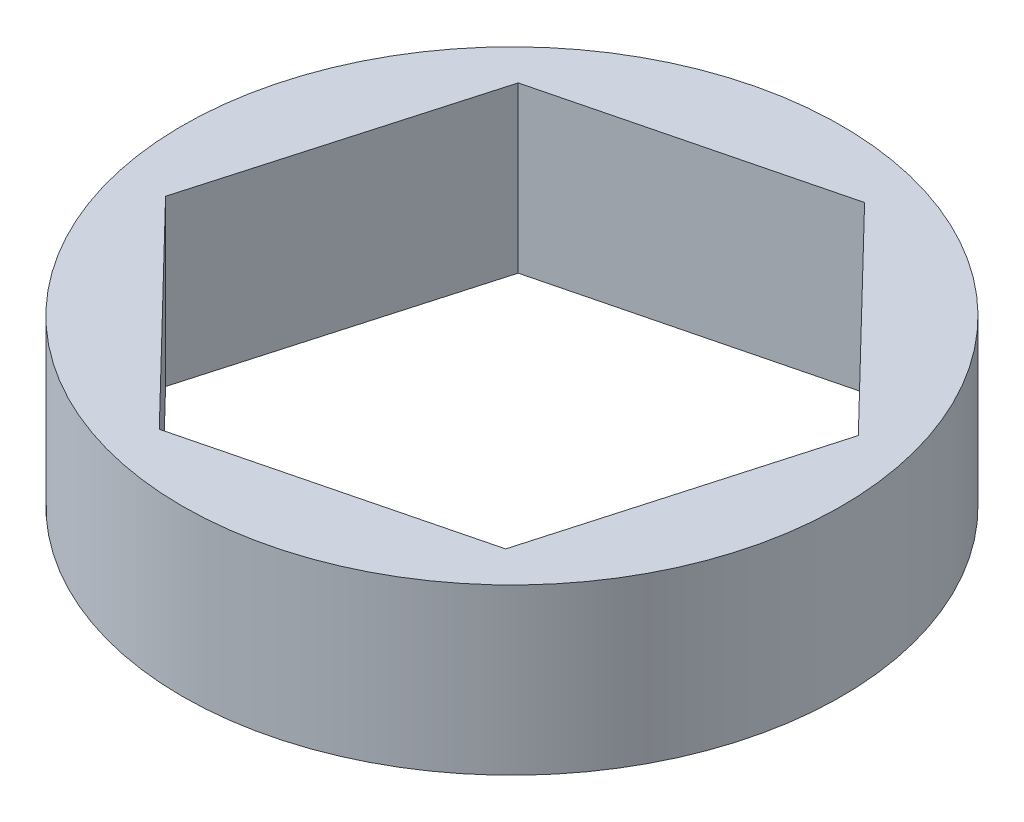
ISO-10303-21;
HEADER;
FILE_DESCRIPTION(('STEP AP214'),'2;1');
FILE_NAME('part.step','',(''),(''),'','','');
FILE_SCHEMA(('AUTOMOTIVE_DESIGN { 1 0 10303 214 1 1 1 1 }'));
ENDSEC;
DATA;
#1=APPLICATION_CONTEXT('core data for automotive mechanical design processes');
#2=APPLICATION_PROTOCOL_DEFINITION('international standard','automotive_design',2000,#1);
#3=PRODUCT_CONTEXT('',#1,'mechanical');
#4=PRODUCT('Part','Part','',(#3));
#5=PRODUCT_RELATED_PRODUCT_CATEGORY('part','',(#4));
#6=PRODUCT_DEFINITION_FORMATION('','',#4);
#7=PRODUCT_DEFINITION_CONTEXT('part definition',#1,'design');
#8=PRODUCT_DEFINITION('design','',#6,#7);
#9=PRODUCT_DEFINITION_SHAPE('','',#8);
#10=(LENGTH_UNIT() NAMED_UNIT(*) SI_UNIT(.MILLI.,.METRE.));
#11=(NAMED_UNIT(*) PLANE_ANGLE_UNIT() SI_UNIT($,.RADIAN.));
#12=(NAMED_UNIT(*) SI_UNIT($,.STERADIAN.) SOLID_ANGLE_UNIT());
#13=UNCERTAINTY_MEASURE_WITH_UNIT(LENGTH_MEASURE(1.E-05),#10,'distance_accuracy_value','');
#14=(GEOMETRIC_REPRESENTATION_CONTEXT(3) GLOBAL_UNCERTAINTY_ASSIGNED_CONTEXT((#13)) GLOBAL_UNIT_ASSIGNED_CONTEXT((#10,
#11,#12)) REPRESENTATION_CONTEXT('',''));
#15=CARTESIAN_POINT('',(0.,0.,0.));
#16=DIRECTION('',(0.,0.,1.));
#17=DIRECTION('',(1.,0.,0.));
#18=AXIS2_PLACEMENT_3D('',#15,#16,#17);
#19=CARTESIAN_POINT('',(0.,3.175,0.));
#20=DIRECTION('',(0.,1.,0.));
#21=DIRECTION('',(0.,0.,1.));
#22=AXIS2_PLACEMENT_3D('',#19,#20,#21);
#23=PLANE('',#22);
#24=CARTESIAN_POINT('',(0.,3.175,0.));
#25=DIRECTION('',(0.,1.,0.));
#26=DIRECTION('',(0.,0.,1.));
#27=AXIS2_PLACEMENT_3D('',#24,#25,#26);
#28=CIRCLE('',#27,6.35);
#29=CARTESIAN_POINT('',(0.,3.175,6.35));
#30=VERTEX_POINT('',#29);
#31=EDGE_CURVE('E11',#30,#30,#28,.T.);
#32=ORIENTED_EDGE('',*,*,#31,.T.);
#33=EDGE_LOOP('',(#32));
#34=FACE_BOUND('',#33,.T.);
#35=DIRECTION('',(-0.969830096251339,0.,0.243781837726107));
#36=VECTOR('',#35,1.);
#37=CARTESIAN_POINT('',(1.50566356257848,3.175,-5.28912584803231));
#38=LINE('',#37,#36);
#39=CARTESIAN_POINT('',(1.50566356257848,3.175,-5.28912584803231));
#40=VERTEX_POINT('',#39);
#41=CARTESIAN_POINT('',(-3.82768556691965,3.175,-3.9485058187617));
#42=VERTEX_POINT('',#41);
#43=EDGE_CURVE('E93',#40,#42,#38,.T.);
#44=ORIENTED_EDGE('',*,*,#43,.F.);
#45=DIRECTION('',(-0.696036312577735,0.,-0.718006581845313));
#46=VECTOR('',#45,1.);
#47=CARTESIAN_POINT('',(5.33334912949813,3.175,-1.34062002927061));
#48=LINE('',#47,#46);
#49=CARTESIAN_POINT('',(5.33334912949813,3.175,-1.34062002927061));
#50=VERTEX_POINT('',#49);
#51=EDGE_CURVE('E85',#50,#40,#48,.T.);
#52=ORIENTED_EDGE('',*,*,#51,.F.);
#53=DIRECTION('',(0.273793783673605,0.,-0.961788419571421));
#54=VECTOR('',#53,1.);
#55=CARTESIAN_POINT('',(3.82768556691965,3.175,3.9485058187617));
#56=LINE('',#55,#54);
#57=CARTESIAN_POINT('',(3.82768556691965,3.175,3.9485058187617));
#58=VERTEX_POINT('',#57);
#59=EDGE_CURVE('E113',#58,#50,#56,.T.);
#60=ORIENTED_EDGE('',*,*,#59,.F.);
#61=DIRECTION('',(0.969830096251339,0.,-0.243781837726108));
#62=VECTOR('',#61,1.);
#63=CARTESIAN_POINT('',(-1.50566356257847,3.175,5.28912584803231));
#64=LINE('',#63,#62);
#65=CARTESIAN_POINT('',(-1.50566356257847,3.175,5.28912584803231));
#66=VERTEX_POINT('',#65);
#67=EDGE_CURVE('E111',#66,#58,#64,.T.);
#68=ORIENTED_EDGE('',*,*,#67,.F.);
#69=DIRECTION('',(0.696036312577735,0.,0.718006581845313));
#70=VECTOR('',#69,1.);
#71=CARTESIAN_POINT('',(-5.33334912949813,3.175,1.34062002927061));
#72=LINE('',#71,#70);
#73=CARTESIAN_POINT('',(-5.33334912949813,3.175,1.34062002927061));
#74=VERTEX_POINT('',#73);
#75=EDGE_CURVE('E107',#74,#66,#72,.T.);
#76=ORIENTED_EDGE('',*,*,#75,.F.);
#77=DIRECTION('',(-0.273793783673604,0.,0.961788419571421));
#78=VECTOR('',#77,1.);
#79=CARTESIAN_POINT('',(-3.82768556691965,3.175,-3.9485058187617));
#80=LINE('',#79,#78);
#81=EDGE_CURVE('E105',#42,#74,#80,.T.);
#82=ORIENTED_EDGE('',*,*,#81,.F.);
#83=EDGE_LOOP('',(#44,#52,#60,#68,#76,#82));
#84=FACE_BOUND('',#83,.T.);
#85=ADVANCED_FACE('F32',(#34,#84),#23,.T.);
#86=CARTESIAN_POINT('',(0.,0.,0.));
#87=DIRECTION('',(0.,1.,0.));
#88=DIRECTION('',(0.,0.,1.));
#89=AXIS2_PLACEMENT_3D('',#86,#87,#88);
#90=PLANE('',#89);
#91=CARTESIAN_POINT('',(0.,0.,0.));
#92=DIRECTION('',(0.,1.,0.));
#93=DIRECTION('',(0.,0.,1.));
#94=AXIS2_PLACEMENT_3D('',#91,#92,#93);
#95=CIRCLE('',#94,6.35);
#96=CARTESIAN_POINT('',(0.,0.,6.35));
#97=VERTEX_POINT('',#96);
#98=EDGE_CURVE('E36',#97,#97,#95,.T.);
#99=ORIENTED_EDGE('',*,*,#98,.F.);
#100=EDGE_LOOP('',(#99));
#101=FACE_BOUND('',#100,.T.);
#102=DIRECTION('',(-0.696036312577735,0.,-0.718006581845313));
#103=VECTOR('',#102,1.);
#104=CARTESIAN_POINT('',(5.33334912949813,0.,-1.34062002927061));
#105=LINE('',#104,#103);
#106=CARTESIAN_POINT('',(5.33334912949813,0.,-1.34062002927061));
#107=VERTEX_POINT('',#106);
#108=CARTESIAN_POINT('',(1.50566356257848,0.,-5.28912584803231));
#109=VERTEX_POINT('',#108);
#110=EDGE_CURVE('E55',#107,#109,#105,.T.);
#111=ORIENTED_EDGE('',*,*,#110,.T.);
#112=DIRECTION('',(-0.969830096251339,0.,0.243781837726107));
#113=VECTOR('',#112,1.);
#114=CARTESIAN_POINT('',(1.50566356257848,0.,-5.28912584803231));
#115=LINE('',#114,#113);
#116=CARTESIAN_POINT('',(-3.82768556691965,0.,-3.9485058187617));
#117=VERTEX_POINT('',#116);
#118=EDGE_CURVE('E100',#109,#117,#115,.T.);
#119=ORIENTED_EDGE('',*,*,#118,.T.);
#120=DIRECTION('',(-0.273793783673604,0.,0.961788419571421));
#121=VECTOR('',#120,1.);
#122=CARTESIAN_POINT('',(-3.82768556691965,0.,-3.9485058187617));
#123=LINE('',#122,#121);
#124=CARTESIAN_POINT('',(-5.33334912949813,0.,1.34062002927061));
#125=VERTEX_POINT('',#124);
#126=EDGE_CURVE('E117',#117,#125,#123,.T.);
#127=ORIENTED_EDGE('',*,*,#126,.T.);
#128=DIRECTION('',(0.696036312577735,0.,0.718006581845313));
#129=VECTOR('',#128,1.);
#130=CARTESIAN_POINT('',(-5.33334912949813,0.,1.34062002927061));
#131=LINE('',#130,#129);
#132=CARTESIAN_POINT('',(-1.50566356257847,0.,5.28912584803231));
#133=VERTEX_POINT('',#132);
#134=EDGE_CURVE('E120',#125,#133,#131,.T.);
#135=ORIENTED_EDGE('',*,*,#134,.T.);
#136=DIRECTION('',(0.969830096251339,0.,-0.243781837726108));
#137=VECTOR('',#136,1.);
#138=CARTESIAN_POINT('',(-1.50566356257847,0.,5.28912584803231));
#139=LINE('',#138,#137);
#140=CARTESIAN_POINT('',(3.82768556691965,0.,3.9485058187617));
#141=VERTEX_POINT('',#140);
#142=EDGE_CURVE('E123',#133,#141,#139,.T.);
#143=ORIENTED_EDGE('',*,*,#142,.T.);
#144=DIRECTION('',(0.273793783673605,0.,-0.961788419571421));
#145=VECTOR('',#144,1.);
#146=CARTESIAN_POINT('',(3.82768556691965,0.,3.9485058187617));
#147=LINE('',#146,#145);
#148=EDGE_CURVE('E94',#141,#107,#147,.T.);
#149=ORIENTED_EDGE('',*,*,#148,.T.);
#150=EDGE_LOOP('',(#111,#119,#127,#135,#143,#149));
#151=FACE_BOUND('',#150,.T.);
#152=ADVANCED_FACE('F140',(#101,#151),#90,.F.);
#153=CARTESIAN_POINT('',(0.,3.175,0.));
#154=DIRECTION('',(0.,-1.,0.));
#155=DIRECTION('',(0.,0.,-1.));
#156=AXIS2_PLACEMENT_3D('',#153,#154,#155);
#157=CYLINDRICAL_SURFACE('',#156,6.35);
#158=ORIENTED_EDGE('',*,*,#31,.F.);
#159=EDGE_LOOP('',(#158));
#160=FACE_BOUND('',#159,.T.);
#161=ORIENTED_EDGE('',*,*,#98,.T.);
#162=EDGE_LOOP('',(#161));
#163=FACE_BOUND('',#162,.T.);
#164=ADVANCED_FACE('F34',(#160,#163),#157,.T.);
#165=CARTESIAN_POINT('',(5.33334912949813,3.175,-1.34062002927061));
#166=DIRECTION('',(-0.718006581845313,0.,0.696036312577735));
#167=DIRECTION('',(0.696036312577735,0.,0.718006581845313));
#168=AXIS2_PLACEMENT_3D('',#165,#166,#167);
#169=PLANE('',#168);
#170=ORIENTED_EDGE('',*,*,#110,.F.);
#171=DIRECTION('',(0.,-1.,0.));
#172=VECTOR('',#171,1.);
#173=CARTESIAN_POINT('',(5.33334912949813,3.175,-1.34062002927061));
#174=LINE('',#173,#172);
#175=EDGE_CURVE('E89',#50,#107,#174,.T.);
#176=ORIENTED_EDGE('',*,*,#175,.F.);
#177=ORIENTED_EDGE('',*,*,#51,.T.);
#178=DIRECTION('',(0.,-1.,0.));
#179=VECTOR('',#178,1.);
#180=CARTESIAN_POINT('',(1.50566356257848,3.175,-5.28912584803231));
#181=LINE('',#180,#179);
#182=EDGE_CURVE('E88',#40,#109,#181,.T.);
#183=ORIENTED_EDGE('',*,*,#182,.T.);
#184=EDGE_LOOP('',(#170,#176,#177,#183));
#185=FACE_BOUND('',#184,.T.);
#186=ADVANCED_FACE('F87',(#185),#169,.T.);
#187=CARTESIAN_POINT('',(1.50566356257848,3.175,-5.28912584803231));
#188=DIRECTION('',(0.243781837726107,0.,0.969830096251339));
#189=DIRECTION('',(0.969830096251339,0.,-0.243781837726107));
#190=AXIS2_PLACEMENT_3D('',#187,#188,#189);
#191=PLANE('',#190);
#192=ORIENTED_EDGE('',*,*,#118,.F.);
#193=ORIENTED_EDGE('',*,*,#182,.F.);
#194=ORIENTED_EDGE('',*,*,#43,.T.);
#195=DIRECTION('',(0.,-1.,0.));
#196=VECTOR('',#195,1.);
#197=CARTESIAN_POINT('',(-3.82768556691965,3.175,-3.9485058187617));
#198=LINE('',#197,#196);
#199=EDGE_CURVE('E101',#42,#117,#198,.T.);
#200=ORIENTED_EDGE('',*,*,#199,.T.);
#201=EDGE_LOOP('',(#192,#193,#194,#200));
#202=FACE_BOUND('',#201,.T.);
#203=ADVANCED_FACE('F97',(#202),#191,.T.);
#204=CARTESIAN_POINT('',(-3.82768556691965,3.175,-3.9485058187617));
#205=DIRECTION('',(0.961788419571421,0.,0.273793783673604));
#206=DIRECTION('',(0.273793783673604,0.,-0.961788419571421));
#207=AXIS2_PLACEMENT_3D('',#204,#205,#206);
#208=PLANE('',#207);
#209=ORIENTED_EDGE('',*,*,#126,.F.);
#210=ORIENTED_EDGE('',*,*,#199,.F.);
#211=ORIENTED_EDGE('',*,*,#81,.T.);
#212=DIRECTION('',(0.,-1.,0.));
#213=VECTOR('',#212,1.);
#214=CARTESIAN_POINT('',(-5.33334912949813,3.175,1.34062002927061));
#215=LINE('',#214,#213);
#216=EDGE_CURVE('E132',#74,#125,#215,.T.);
#217=ORIENTED_EDGE('',*,*,#216,.T.);
#218=EDGE_LOOP('',(#209,#210,#211,#217));
#219=FACE_BOUND('',#218,.T.);
#220=ADVANCED_FACE('F136',(#219),#208,.T.);
#221=CARTESIAN_POINT('',(-5.33334912949813,3.175,1.34062002927061));
#222=DIRECTION('',(0.718006581845313,0.,-0.696036312577735));
#223=DIRECTION('',(-0.696036312577735,0.,-0.718006581845313));
#224=AXIS2_PLACEMENT_3D('',#221,#222,#223);
#225=PLANE('',#224);
#226=ORIENTED_EDGE('',*,*,#134,.F.);
#227=ORIENTED_EDGE('',*,*,#216,.F.);
#228=ORIENTED_EDGE('',*,*,#75,.T.);
#229=DIRECTION('',(0.,-1.,0.));
#230=VECTOR('',#229,1.);
#231=CARTESIAN_POINT('',(-1.50566356257847,3.175,5.28912584803231));
#232=LINE('',#231,#230);
#233=EDGE_CURVE('E130',#66,#133,#232,.T.);
#234=ORIENTED_EDGE('',*,*,#233,.T.);
#235=EDGE_LOOP('',(#226,#227,#228,#234));
#236=FACE_BOUND('',#235,.T.);
#237=ADVANCED_FACE('F148',(#236),#225,.T.);
#238=CARTESIAN_POINT('',(-1.50566356257847,3.175,5.28912584803231));
#239=DIRECTION('',(-0.243781837726108,0.,-0.969830096251339));
#240=DIRECTION('',(-0.969830096251339,0.,0.243781837726108));
#241=AXIS2_PLACEMENT_3D('',#238,#239,#240);
#242=PLANE('',#241);
#243=ORIENTED_EDGE('',*,*,#142,.F.);
#244=ORIENTED_EDGE('',*,*,#233,.F.);
#245=ORIENTED_EDGE('',*,*,#67,.T.);
#246=DIRECTION('',(0.,-1.,0.));
#247=VECTOR('',#246,1.);
#248=CARTESIAN_POINT('',(3.82768556691965,3.175,3.9485058187617));
#249=LINE('',#248,#247);
#250=EDGE_CURVE('E47',#58,#141,#249,.T.);
#251=ORIENTED_EDGE('',*,*,#250,.T.);
#252=EDGE_LOOP('',(#243,#244,#245,#251));
#253=FACE_BOUND('',#252,.T.);
#254=ADVANCED_FACE('F146',(#253),#242,.T.);
#255=CARTESIAN_POINT('',(3.82768556691965,3.175,3.9485058187617));
#256=DIRECTION('',(-0.961788419571421,0.,-0.273793783673605));
#257=DIRECTION('',(-0.273793783673605,0.,0.961788419571421));
#258=AXIS2_PLACEMENT_3D('',#255,#256,#257);
#259=PLANE('',#258);
#260=ORIENTED_EDGE('',*,*,#148,.F.);
#261=ORIENTED_EDGE('',*,*,#250,.F.);
#262=ORIENTED_EDGE('',*,*,#59,.T.);
#263=ORIENTED_EDGE('',*,*,#175,.T.);
#264=EDGE_LOOP('',(#260,#261,#262,#263));
#265=FACE_BOUND('',#264,.T.);
#266=ADVANCED_FACE('F142',(#265),#259,.T.);
#267=CLOSED_SHELL('',(#85,#152,#164,#186,#203,#220,#237,#254,#266));
#268=MANIFOLD_SOLID_BREP('B2',#267);
#269=ADVANCED_BREP_SHAPE_REPRESENTATION('',(#18,#268),#14);
#270=SHAPE_DEFINITION_REPRESENTATION(#9,#269);
ENDSEC;
END-ISO-10303-21;
